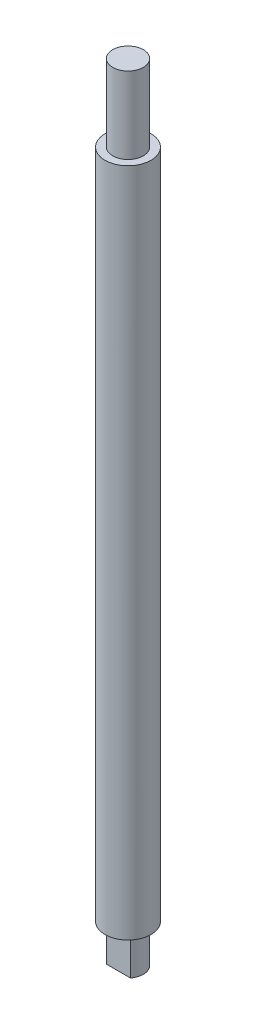
ISO-10303-21;
HEADER;
FILE_DESCRIPTION(('STEP AP214'),'2;1');
FILE_NAME('part.step','',(''),(''),'','','');
FILE_SCHEMA(('AUTOMOTIVE_DESIGN { 1 0 10303 214 1 1 1 1 }'));
ENDSEC;
DATA;
#1=APPLICATION_CONTEXT('core data for automotive mechanical design processes');
#2=APPLICATION_PROTOCOL_DEFINITION('international standard','automotive_design',2000,#1);
#3=PRODUCT_CONTEXT('',#1,'mechanical');
#4=PRODUCT('Part','Part','',(#3));
#5=PRODUCT_RELATED_PRODUCT_CATEGORY('part','',(#4));
#6=PRODUCT_DEFINITION_FORMATION('','',#4);
#7=PRODUCT_DEFINITION_CONTEXT('part definition',#1,'design');
#8=PRODUCT_DEFINITION('design','',#6,#7);
#9=PRODUCT_DEFINITION_SHAPE('','',#8);
#10=(LENGTH_UNIT() NAMED_UNIT(*) SI_UNIT(.MILLI.,.METRE.));
#11=(NAMED_UNIT(*) PLANE_ANGLE_UNIT() SI_UNIT($,.RADIAN.));
#12=(NAMED_UNIT(*) SI_UNIT($,.STERADIAN.) SOLID_ANGLE_UNIT());
#13=UNCERTAINTY_MEASURE_WITH_UNIT(LENGTH_MEASURE(1.E-05),#10,'distance_accuracy_value','');
#14=(GEOMETRIC_REPRESENTATION_CONTEXT(3) GLOBAL_UNCERTAINTY_ASSIGNED_CONTEXT((#13)) GLOBAL_UNIT_ASSIGNED_CONTEXT((#10,
#11,#12)) REPRESENTATION_CONTEXT('',''));
#15=CARTESIAN_POINT('',(0.,0.,0.));
#16=DIRECTION('',(0.,0.,1.));
#17=DIRECTION('',(1.,0.,0.));
#18=AXIS2_PLACEMENT_3D('',#15,#16,#17);
#19=CARTESIAN_POINT('',(0.,185.,0.));
#20=DIRECTION('',(0.,-1.,0.));
#21=DIRECTION('',(0.,0.,-1.));
#22=AXIS2_PLACEMENT_3D('',#19,#20,#21);
#23=CYLINDRICAL_SURFACE('',#22,6.);
#24=CARTESIAN_POINT('',(0.,185.,0.));
#25=DIRECTION('',(0.,1.,0.));
#26=DIRECTION('',(0.,0.,1.));
#27=AXIS2_PLACEMENT_3D('',#24,#25,#26);
#28=CIRCLE('',#27,6.);
#29=CARTESIAN_POINT('',(0.,185.,6.));
#30=VERTEX_POINT('',#29);
#31=EDGE_CURVE('E39',#30,#30,#28,.T.);
#32=ORIENTED_EDGE('',*,*,#31,.F.);
#33=EDGE_LOOP('',(#32));
#34=FACE_BOUND('',#33,.T.);
#35=CARTESIAN_POINT('',(0.,10.,0.));
#36=DIRECTION('',(0.,-1.,0.));
#37=DIRECTION('',(0.,0.,-1.));
#38=AXIS2_PLACEMENT_3D('',#35,#36,#37);
#39=CIRCLE('',#38,6.);
#40=CARTESIAN_POINT('',(0.,10.,-6.));
#41=VERTEX_POINT('',#40);
#42=EDGE_CURVE('E68',#41,#41,#39,.T.);
#43=ORIENTED_EDGE('',*,*,#42,.F.);
#44=EDGE_LOOP('',(#43));
#45=FACE_BOUND('',#44,.T.);
#46=ADVANCED_FACE('F32',(#34,#45),#23,.T.);
#47=CARTESIAN_POINT('',(0.,185.,0.));
#48=DIRECTION('',(0.,1.,0.));
#49=DIRECTION('',(0.,0.,1.));
#50=AXIS2_PLACEMENT_3D('',#47,#48,#49);
#51=PLANE('',#50);
#52=ORIENTED_EDGE('',*,*,#31,.T.);
#53=EDGE_LOOP('',(#52));
#54=FACE_BOUND('',#53,.T.);
#55=CARTESIAN_POINT('',(0.,185.,0.));
#56=DIRECTION('',(0.,1.,0.));
#57=DIRECTION('',(0.,0.,1.));
#58=AXIS2_PLACEMENT_3D('',#55,#56,#57);
#59=CIRCLE('',#58,4.);
#60=CARTESIAN_POINT('',(0.,185.,4.));
#61=VERTEX_POINT('',#60);
#62=EDGE_CURVE('E74',#61,#61,#59,.T.);
#63=ORIENTED_EDGE('',*,*,#62,.F.);
#64=EDGE_LOOP('',(#63));
#65=FACE_BOUND('',#64,.T.);
#66=ADVANCED_FACE('F84',(#54,#65),#51,.T.);
#67=CARTESIAN_POINT('',(0.,205.,0.));
#68=DIRECTION('',(0.,-1.,0.));
#69=DIRECTION('',(0.,0.,-1.));
#70=AXIS2_PLACEMENT_3D('',#67,#68,#69);
#71=CYLINDRICAL_SURFACE('',#70,4.);
#72=CARTESIAN_POINT('',(0.,205.,0.));
#73=DIRECTION('',(0.,1.,0.));
#74=DIRECTION('',(0.,0.,1.));
#75=AXIS2_PLACEMENT_3D('',#72,#73,#74);
#76=CIRCLE('',#75,4.);
#77=CARTESIAN_POINT('',(0.,205.,4.));
#78=VERTEX_POINT('',#77);
#79=EDGE_CURVE('E71',#78,#78,#76,.T.);
#80=ORIENTED_EDGE('',*,*,#79,.F.);
#81=EDGE_LOOP('',(#80));
#82=FACE_BOUND('',#81,.T.);
#83=ORIENTED_EDGE('',*,*,#62,.T.);
#84=EDGE_LOOP('',(#83));
#85=FACE_BOUND('',#84,.T.);
#86=ADVANCED_FACE('F89',(#82,#85),#71,.T.);
#87=CARTESIAN_POINT('',(0.,205.,0.));
#88=DIRECTION('',(0.,1.,0.));
#89=DIRECTION('',(0.,0.,1.));
#90=AXIS2_PLACEMENT_3D('',#87,#88,#89);
#91=PLANE('',#90);
#92=ORIENTED_EDGE('',*,*,#79,.T.);
#93=EDGE_LOOP('',(#92));
#94=FACE_BOUND('',#93,.T.);
#95=ADVANCED_FACE('F97',(#94),#91,.T.);
#96=CARTESIAN_POINT('',(0.,10.,0.));
#97=DIRECTION('',(0.,-1.,0.));
#98=DIRECTION('',(0.,0.,-1.));
#99=AXIS2_PLACEMENT_3D('',#96,#97,#98);
#100=PLANE('',#99);
#101=CARTESIAN_POINT('',(0.,10.,0.));
#102=DIRECTION('',(0.,-1.,0.));
#103=DIRECTION('',(0.,0.,-1.));
#104=AXIS2_PLACEMENT_3D('',#101,#102,#103);
#105=CIRCLE('',#104,4.);
#106=CARTESIAN_POINT('',(-3.1224989991992,10.,2.5));
#107=VERTEX_POINT('',#106);
#108=CARTESIAN_POINT('',(3.1224989991992,10.,2.5));
#109=VERTEX_POINT('',#108);
#110=EDGE_CURVE('E64',#107,#109,#105,.T.);
#111=ORIENTED_EDGE('',*,*,#110,.F.);
#112=DIRECTION('',(1.,0.,0.));
#113=VECTOR('',#112,1.);
#114=CARTESIAN_POINT('',(-4.48636236279294,10.,2.5));
#115=LINE('',#114,#113);
#116=EDGE_CURVE('E120',#107,#109,#115,.T.);
#117=ORIENTED_EDGE('',*,*,#116,.T.);
#118=EDGE_LOOP('',(#111,#117));
#119=FACE_BOUND('',#118,.T.);
#120=ORIENTED_EDGE('',*,*,#42,.T.);
#121=EDGE_LOOP('',(#120));
#122=FACE_BOUND('',#121,.T.);
#123=ADVANCED_FACE('F81',(#119,#122),#100,.T.);
#124=CARTESIAN_POINT('',(0.,10.,0.));
#125=DIRECTION('',(0.,-1.,0.));
#126=DIRECTION('',(0.,0.,-1.));
#127=AXIS2_PLACEMENT_3D('',#124,#125,#126);
#128=CYLINDRICAL_SURFACE('',#127,4.);
#129=DIRECTION('',(0.,-1.,0.));
#130=VECTOR('',#129,1.);
#131=CARTESIAN_POINT('',(3.1224989991992,10.,2.5));
#132=LINE('',#131,#130);
#133=CARTESIAN_POINT('',(3.1224989991992,0.,2.5));
#134=VERTEX_POINT('',#133);
#135=EDGE_CURVE('E50',#134,#109,#132,.F.);
#136=ORIENTED_EDGE('',*,*,#135,.F.);
#137=CARTESIAN_POINT('',(0.,0.,0.));
#138=DIRECTION('',(0.,-1.,0.));
#139=DIRECTION('',(0.,0.,-1.));
#140=AXIS2_PLACEMENT_3D('',#137,#138,#139);
#141=CIRCLE('',#140,4.);
#142=CARTESIAN_POINT('',(-3.1224989991992,0.,2.5));
#143=VERTEX_POINT('',#142);
#144=EDGE_CURVE('E62',#143,#134,#141,.T.);
#145=ORIENTED_EDGE('',*,*,#144,.F.);
#146=DIRECTION('',(0.,-1.,0.));
#147=VECTOR('',#146,1.);
#148=CARTESIAN_POINT('',(-3.1224989991992,10.,2.5));
#149=LINE('',#148,#147);
#150=EDGE_CURVE('E46',#107,#143,#149,.T.);
#151=ORIENTED_EDGE('',*,*,#150,.F.);
#152=ORIENTED_EDGE('',*,*,#110,.T.);
#153=EDGE_LOOP('',(#136,#145,#151,#152));
#154=FACE_BOUND('',#153,.T.);
#155=ADVANCED_FACE('F61',(#154),#128,.T.);
#156=CARTESIAN_POINT('',(0.,0.,0.));
#157=DIRECTION('',(0.,1.,0.));
#158=DIRECTION('',(0.,0.,1.));
#159=AXIS2_PLACEMENT_3D('',#156,#157,#158);
#160=PLANE('',#159);
#161=ORIENTED_EDGE('',*,*,#144,.T.);
#162=DIRECTION('',(-1.,0.,0.));
#163=VECTOR('',#162,1.);
#164=CARTESIAN_POINT('',(0.,0.,2.5));
#165=LINE('',#164,#163);
#166=EDGE_CURVE('E11',#134,#143,#165,.T.);
#167=ORIENTED_EDGE('',*,*,#166,.T.);
#168=EDGE_LOOP('',(#161,#167));
#169=FACE_BOUND('',#168,.T.);
#170=ADVANCED_FACE('F66',(#169),#160,.F.);
#171=CARTESIAN_POINT('',(-4.48636236279294,10.,2.5));
#172=DIRECTION('',(0.,0.,-1.));
#173=DIRECTION('',(-1.,0.,0.));
#174=AXIS2_PLACEMENT_3D('',#171,#172,#173);
#175=PLANE('',#174);
#176=ORIENTED_EDGE('',*,*,#135,.T.);
#177=ORIENTED_EDGE('',*,*,#116,.F.);
#178=ORIENTED_EDGE('',*,*,#150,.T.);
#179=ORIENTED_EDGE('',*,*,#166,.F.);
#180=EDGE_LOOP('',(#176,#177,#178,#179));
#181=FACE_BOUND('',#180,.T.);
#182=ADVANCED_FACE('F55',(#181),#175,.F.);
#183=CLOSED_SHELL('',(#46,#66,#86,#95,#123,#155,#170,#182));
#184=MANIFOLD_SOLID_BREP('B2',#183);
#185=ADVANCED_BREP_SHAPE_REPRESENTATION('',(#18,#184),#14);
#186=SHAPE_DEFINITION_REPRESENTATION(#9,#185);
ENDSEC;
END-ISO-10303-21;
